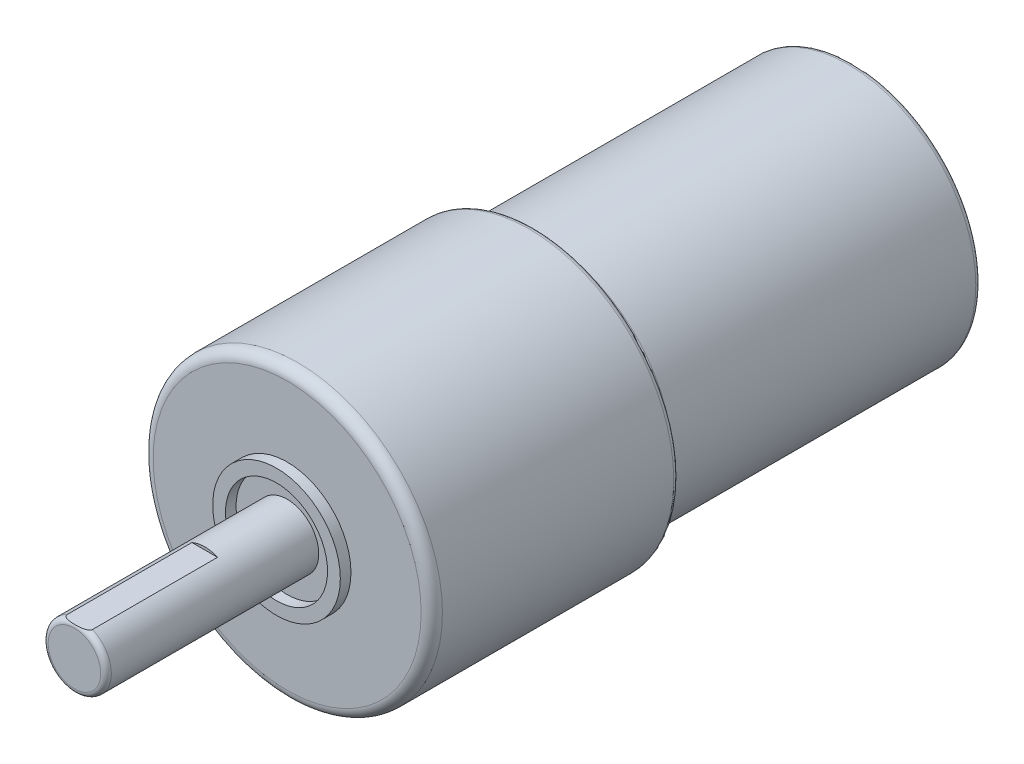
ISO-10303-21;
HEADER;
FILE_DESCRIPTION(('STEP AP214'),'2;1');
FILE_NAME('part.step','',(''),(''),'','','');
FILE_SCHEMA(('AUTOMOTIVE_DESIGN { 1 0 10303 214 1 1 1 1 }'));
ENDSEC;
DATA;
#1=APPLICATION_CONTEXT('core data for automotive mechanical design processes');
#2=APPLICATION_PROTOCOL_DEFINITION('international standard','automotive_design',2000,#1);
#3=PRODUCT_CONTEXT('',#1,'mechanical');
#4=PRODUCT('Part','Part','',(#3));
#5=PRODUCT_RELATED_PRODUCT_CATEGORY('part','',(#4));
#6=PRODUCT_DEFINITION_FORMATION('','',#4);
#7=PRODUCT_DEFINITION_CONTEXT('part definition',#1,'design');
#8=PRODUCT_DEFINITION('design','',#6,#7);
#9=PRODUCT_DEFINITION_SHAPE('','',#8);
#10=(LENGTH_UNIT() NAMED_UNIT(*) SI_UNIT(.MILLI.,.METRE.));
#11=(NAMED_UNIT(*) PLANE_ANGLE_UNIT() SI_UNIT($,.RADIAN.));
#12=(NAMED_UNIT(*) SI_UNIT($,.STERADIAN.) SOLID_ANGLE_UNIT());
#13=UNCERTAINTY_MEASURE_WITH_UNIT(LENGTH_MEASURE(1.E-05),#10,'distance_accuracy_value','');
#14=(GEOMETRIC_REPRESENTATION_CONTEXT(3) GLOBAL_UNCERTAINTY_ASSIGNED_CONTEXT((#13)) GLOBAL_UNIT_ASSIGNED_CONTEXT((#10,
#11,#12)) REPRESENTATION_CONTEXT('',''));
#15=CARTESIAN_POINT('',(0.,0.,0.));
#16=DIRECTION('',(0.,0.,1.));
#17=DIRECTION('',(1.,0.,0.));
#18=AXIS2_PLACEMENT_3D('',#15,#16,#17);
#19=CARTESIAN_POINT('',(0.,0.,-53.25));
#20=DIRECTION('',(0.,0.,1.));
#21=DIRECTION('',(1.,0.,0.));
#22=AXIS2_PLACEMENT_3D('',#19,#20,#21);
#23=CYLINDRICAL_SURFACE('',#22,12.);
#24=CARTESIAN_POINT('',(0.,0.,-52.75));
#25=DIRECTION('',(0.,0.,-1.));
#26=DIRECTION('',(-1.,0.,0.));
#27=AXIS2_PLACEMENT_3D('',#24,#25,#26);
#28=CIRCLE('',#27,12.);
#29=CARTESIAN_POINT('',(-12.,0.,-52.75));
#30=VERTEX_POINT('',#29);
#31=EDGE_CURVE('E11',#30,#30,#28,.F.);
#32=ORIENTED_EDGE('',*,*,#31,.T.);
#33=EDGE_LOOP('',(#32));
#34=FACE_BOUND('',#33,.T.);
#35=CARTESIAN_POINT('',(0.,0.,-24.25));
#36=DIRECTION('',(0.,0.,-1.));
#37=DIRECTION('',(-1.,0.,0.));
#38=AXIS2_PLACEMENT_3D('',#35,#36,#37);
#39=CIRCLE('',#38,12.);
#40=CARTESIAN_POINT('',(-12.,0.,-24.25));
#41=VERTEX_POINT('',#40);
#42=EDGE_CURVE('E68',#41,#41,#39,.T.);
#43=ORIENTED_EDGE('',*,*,#42,.T.);
#44=EDGE_LOOP('',(#43));
#45=FACE_BOUND('',#44,.T.);
#46=ADVANCED_FACE('F53',(#34,#45),#23,.T.);
#47=CARTESIAN_POINT('',(0.,0.,-53.25));
#48=DIRECTION('',(0.,0.,-1.));
#49=DIRECTION('',(-1.,0.,0.));
#50=AXIS2_PLACEMENT_3D('',#47,#48,#49);
#51=PLANE('',#50);
#52=CARTESIAN_POINT('',(0.,0.,-53.25));
#53=DIRECTION('',(0.,0.,-1.));
#54=DIRECTION('',(-1.,0.,0.));
#55=AXIS2_PLACEMENT_3D('',#52,#53,#54);
#56=CIRCLE('',#55,11.5);
#57=CARTESIAN_POINT('',(-11.5,0.,-53.25));
#58=VERTEX_POINT('',#57);
#59=EDGE_CURVE('E60',#58,#58,#56,.T.);
#60=ORIENTED_EDGE('',*,*,#59,.T.);
#61=EDGE_LOOP('',(#60));
#62=FACE_BOUND('',#61,.T.);
#63=ADVANCED_FACE('F84',(#62),#51,.T.);
#64=CARTESIAN_POINT('',(0.,0.,-23.25));
#65=DIRECTION('',(0.,0.,-1.));
#66=DIRECTION('',(-1.,0.,0.));
#67=AXIS2_PLACEMENT_3D('',#64,#65,#66);
#68=PLANE('',#67);
#69=CARTESIAN_POINT('',(0.,0.,-23.25));
#70=DIRECTION('',(0.,0.,-1.));
#71=DIRECTION('',(-1.,0.,0.));
#72=AXIS2_PLACEMENT_3D('',#69,#70,#71);
#73=CIRCLE('',#72,11.);
#74=CARTESIAN_POINT('',(-11.,0.,-23.25));
#75=VERTEX_POINT('',#74);
#76=EDGE_CURVE('E64',#75,#75,#73,.F.);
#77=ORIENTED_EDGE('',*,*,#76,.T.);
#78=EDGE_LOOP('',(#77));
#79=FACE_BOUND('',#78,.T.);
#80=ADVANCED_FACE('F77',(#79),#68,.F.);
#81=CARTESIAN_POINT('',(0.,0.,-24.25));
#82=DIRECTION('',(0.,0.,-1.));
#83=DIRECTION('',(-1.,0.,0.));
#84=AXIS2_PLACEMENT_3D('',#81,#82,#83);
#85=TOROIDAL_SURFACE('',#84,11.,1.);
#86=ORIENTED_EDGE('',*,*,#76,.F.);
#87=EDGE_LOOP('',(#86));
#88=FACE_BOUND('',#87,.T.);
#89=ORIENTED_EDGE('',*,*,#42,.F.);
#90=EDGE_LOOP('',(#89));
#91=FACE_BOUND('',#90,.T.);
#92=ADVANCED_FACE('F75',(#88,#91),#85,.T.);
#93=CARTESIAN_POINT('',(0.,0.,-52.75));
#94=DIRECTION('',(0.,0.,-1.));
#95=DIRECTION('',(-1.,0.,0.));
#96=AXIS2_PLACEMENT_3D('',#93,#94,#95);
#97=TOROIDAL_SURFACE('',#96,11.5,0.5);
#98=ORIENTED_EDGE('',*,*,#31,.F.);
#99=EDGE_LOOP('',(#98));
#100=FACE_BOUND('',#99,.T.);
#101=ORIENTED_EDGE('',*,*,#59,.F.);
#102=EDGE_LOOP('',(#101));
#103=FACE_BOUND('',#102,.T.);
#104=ADVANCED_FACE('F55',(#100,#103),#97,.T.);
#105=CLOSED_SHELL('',(#46,#63,#80,#92,#104));
#106=MANIFOLD_SOLID_BREP('B2',#105);
#107=CARTESIAN_POINT('',(0.,0.,-23.25));
#108=DIRECTION('',(0.,0.,1.));
#109=DIRECTION('',(1.,0.,0.));
#110=AXIS2_PLACEMENT_3D('',#107,#108,#109);
#111=CYLINDRICAL_SURFACE('',#110,13.6000000000003);
#112=CARTESIAN_POINT('',(0.,0.,-22.75));
#113=DIRECTION('',(0.,0.,1.));
#114=DIRECTION('',(1.,0.,0.));
#115=AXIS2_PLACEMENT_3D('',#112,#113,#114);
#116=CIRCLE('',#115,13.6000000000003);
#117=CARTESIAN_POINT('',(13.6000000000003,0.,-22.75));
#118=VERTEX_POINT('',#117);
#119=EDGE_CURVE('E142',#118,#118,#116,.T.);
#120=CARTESIAN_POINT('',(0.,0.,-1.));
#121=DIRECTION('',(0.,0.,1.));
#122=DIRECTION('',(1.,0.,0.));
#123=AXIS2_PLACEMENT_3D('',#120,#121,#122);
#124=CIRCLE('',#123,13.6000000000003);
#125=CARTESIAN_POINT('',(13.6000000000003,0.,-1.));
#126=VERTEX_POINT('',#125);
#127=EDGE_CURVE('E199',#126,#126,#124,.F.);
#128=CARTESIAN_POINT('',(13.6000000000003,0.,-22.75));
#129=CARTESIAN_POINT('',(13.6000000000003,0.,-22.5234375));
#130=CARTESIAN_POINT('',(13.6000000000003,0.,-22.296875));
#131=CARTESIAN_POINT('',(13.6000000000003,0.,-21.84375));
#132=CARTESIAN_POINT('',(13.6000000000003,0.,-21.6171875));
#133=CARTESIAN_POINT('',(13.6000000000003,0.,-21.1640625));
#134=CARTESIAN_POINT('',(13.6000000000003,0.,-20.9375));
#135=CARTESIAN_POINT('',(13.6000000000003,0.,-20.484375));
#136=CARTESIAN_POINT('',(13.6000000000003,0.,-20.2578125));
#137=CARTESIAN_POINT('',(13.6000000000003,0.,-19.8046875));
#138=CARTESIAN_POINT('',(13.6000000000003,0.,-19.578125));
#139=CARTESIAN_POINT('',(13.6000000000003,0.,-19.125));
#140=CARTESIAN_POINT('',(13.6000000000003,0.,-18.8984375));
#141=CARTESIAN_POINT('',(13.6000000000003,0.,-18.4453125));
#142=CARTESIAN_POINT('',(13.6000000000003,0.,-18.21875));
#143=CARTESIAN_POINT('',(13.6000000000003,0.,-17.765625));
#144=CARTESIAN_POINT('',(13.6000000000003,0.,-17.5390625));
#145=CARTESIAN_POINT('',(13.6000000000003,0.,-17.0859375));
#146=CARTESIAN_POINT('',(13.6000000000003,0.,-16.859375));
#147=CARTESIAN_POINT('',(13.6000000000003,0.,-16.40625));
#148=CARTESIAN_POINT('',(13.6000000000003,0.,-16.1796875));
#149=CARTESIAN_POINT('',(13.6000000000003,0.,-15.7265625));
#150=CARTESIAN_POINT('',(13.6000000000003,0.,-15.5));
#151=CARTESIAN_POINT('',(13.6000000000003,0.,-15.046875));
#152=CARTESIAN_POINT('',(13.6000000000003,0.,-14.8203125));
#153=CARTESIAN_POINT('',(13.6000000000003,0.,-14.3671875));
#154=CARTESIAN_POINT('',(13.6000000000003,0.,-14.140625));
#155=CARTESIAN_POINT('',(13.6000000000003,0.,-13.6875));
#156=CARTESIAN_POINT('',(13.6000000000003,0.,-13.4609375));
#157=CARTESIAN_POINT('',(13.6000000000003,0.,-13.0078125));
#158=CARTESIAN_POINT('',(13.6000000000003,0.,-12.78125));
#159=CARTESIAN_POINT('',(13.6000000000003,0.,-12.328125));
#160=CARTESIAN_POINT('',(13.6000000000003,0.,-12.1015625));
#161=CARTESIAN_POINT('',(13.6000000000003,0.,-11.6484375));
#162=CARTESIAN_POINT('',(13.6000000000003,0.,-11.421875));
#163=CARTESIAN_POINT('',(13.6000000000003,0.,-10.96875));
#164=CARTESIAN_POINT('',(13.6000000000003,0.,-10.7421875));
#165=CARTESIAN_POINT('',(13.6000000000003,0.,-10.2890625));
#166=CARTESIAN_POINT('',(13.6000000000003,0.,-10.0625));
#167=CARTESIAN_POINT('',(13.6000000000003,0.,-9.60937500000001));
#168=CARTESIAN_POINT('',(13.6000000000003,0.,-9.3828125));
#169=CARTESIAN_POINT('',(13.6000000000003,0.,-8.9296875));
#170=CARTESIAN_POINT('',(13.6000000000003,0.,-8.703125));
#171=CARTESIAN_POINT('',(13.6000000000003,0.,-8.25));
#172=CARTESIAN_POINT('',(13.6000000000003,0.,-8.0234375));
#173=CARTESIAN_POINT('',(13.6000000000003,0.,-7.57031250000001));
#174=CARTESIAN_POINT('',(13.6000000000003,0.,-7.34375000000001));
#175=CARTESIAN_POINT('',(13.6000000000003,0.,-6.89062500000001));
#176=CARTESIAN_POINT('',(13.6000000000003,0.,-6.6640625));
#177=CARTESIAN_POINT('',(13.6000000000003,0.,-6.2109375));
#178=CARTESIAN_POINT('',(13.6000000000003,0.,-5.984375));
#179=CARTESIAN_POINT('',(13.6000000000003,0.,-5.53125000000001));
#180=CARTESIAN_POINT('',(13.6000000000003,0.,-5.30468750000001));
#181=CARTESIAN_POINT('',(13.6000000000003,0.,-4.85156250000001));
#182=CARTESIAN_POINT('',(13.6000000000003,0.,-4.62500000000001));
#183=CARTESIAN_POINT('',(13.6000000000003,0.,-4.17187500000001));
#184=CARTESIAN_POINT('',(13.6000000000003,0.,-3.94531250000001));
#185=CARTESIAN_POINT('',(13.6000000000003,0.,-3.4921875));
#186=CARTESIAN_POINT('',(13.6000000000003,0.,-3.265625));
#187=CARTESIAN_POINT('',(13.6000000000003,0.,-2.81250000000001));
#188=CARTESIAN_POINT('',(13.6000000000003,0.,-2.58593750000001));
#189=CARTESIAN_POINT('',(13.6000000000003,0.,-2.13281250000001));
#190=CARTESIAN_POINT('',(13.6000000000003,0.,-1.90625000000001));
#191=CARTESIAN_POINT('',(13.6000000000003,0.,-1.45312500000001));
#192=CARTESIAN_POINT('',(13.6000000000003,0.,-1.22656250000001));
#193=CARTESIAN_POINT('',(13.6000000000003,0.,-1.));
#194=B_SPLINE_CURVE_WITH_KNOTS('',3,(#128,#129,#130,#131,#132,#133,#134,#135,#136,#137,#138,
#139,#140,#141,#142,#143,#144,#145,#146,#147,#148,#149,#150,#151,#152,#153,#154,#155,#156,#157,
#158,#159,#160,#161,#162,#163,#164,#165,#166,#167,#168,#169,#170,#171,#172,#173,#174,#175,#176,
#177,#178,#179,#180,#181,#182,#183,#184,#185,#186,#187,#188,#189,#190,#191,#192,#193),
.UNSPECIFIED.,.F.,.F.,(4,2,2,2,2,2,2,2,2,2,2,2,2,2,2,2,2,2,2,2,2,2,2,2,2,2,2,2,2,2,2,2,4),(0.,
0.679687500000001,1.359375,2.0390625,2.71875,3.3984375,4.078125,4.7578125,5.4375,6.1171875,
6.796875,7.4765625,8.15625,8.8359375,9.515625,10.1953125,10.875,11.5546875,12.234375,12.9140625,
13.59375,14.2734375,14.953125,15.6328125,16.3125,16.9921875,17.671875,18.3515625,19.03125,
19.7109375,20.390625,21.0703125,21.75),.UNSPECIFIED.);
#195=EDGE_CURVE('BSEAM134',#118,#126,#194,.T.);
#196=ORIENTED_EDGE('',*,*,#119,.T.);
#197=ORIENTED_EDGE('',*,*,#127,.T.);
#198=ORIENTED_EDGE('',*,*,#195,.T.);
#199=ORIENTED_EDGE('',*,*,#195,.F.);
#200=EDGE_LOOP('',(#196,#198,#197,#199));
#201=FACE_BOUND('',#200,.T.);
#202=ADVANCED_FACE('F134',(#201),#111,.T.);
#203=CARTESIAN_POINT('',(0.,0.,-23.25));
#204=DIRECTION('',(0.,0.,1.));
#205=DIRECTION('',(1.,0.,0.));
#206=AXIS2_PLACEMENT_3D('',#203,#204,#205);
#207=PLANE('',#206);
#208=CARTESIAN_POINT('',(0.,0.,-23.25));
#209=DIRECTION('',(0.,0.,1.));
#210=DIRECTION('',(1.,0.,0.));
#211=AXIS2_PLACEMENT_3D('',#208,#209,#210);
#212=CIRCLE('',#211,13.1000000000003);
#213=CARTESIAN_POINT('',(13.1000000000003,0.,-23.25));
#214=VERTEX_POINT('',#213);
#215=EDGE_CURVE('E51',#214,#214,#212,.F.);
#216=ORIENTED_EDGE('',*,*,#215,.T.);
#217=EDGE_LOOP('',(#216));
#218=FACE_BOUND('',#217,.T.);
#219=ADVANCED_FACE('F239',(#218),#207,.F.);
#220=CARTESIAN_POINT('',(0.,0.,0.));
#221=DIRECTION('',(0.,0.,1.));
#222=DIRECTION('',(1.,0.,0.));
#223=AXIS2_PLACEMENT_3D('',#220,#221,#222);
#224=PLANE('',#223);
#225=CARTESIAN_POINT('',(0.,0.,0.));
#226=DIRECTION('',(0.,0.,1.));
#227=DIRECTION('',(1.,0.,0.));
#228=AXIS2_PLACEMENT_3D('',#225,#226,#227);
#229=CIRCLE('',#228,6.);
#230=CARTESIAN_POINT('',(6.,0.,0.));
#231=VERTEX_POINT('',#230);
#232=EDGE_CURVE('E190',#231,#231,#229,.T.);
#233=ORIENTED_EDGE('',*,*,#232,.F.);
#234=EDGE_LOOP('',(#233));
#235=FACE_BOUND('',#234,.T.);
#236=CARTESIAN_POINT('',(0.,0.,0.));
#237=DIRECTION('',(0.,0.,1.));
#238=DIRECTION('',(1.,0.,0.));
#239=AXIS2_PLACEMENT_3D('',#236,#237,#238);
#240=CIRCLE('',#239,12.6000000000003);
#241=CARTESIAN_POINT('',(12.6000000000003,0.,0.));
#242=VERTEX_POINT('',#241);
#243=EDGE_CURVE('E194',#242,#242,#240,.T.);
#244=ORIENTED_EDGE('',*,*,#243,.T.);
#245=EDGE_LOOP('',(#244));
#246=FACE_BOUND('',#245,.T.);
#247=ADVANCED_FACE('F242',(#235,#246),#224,.T.);
#248=CARTESIAN_POINT('',(0.,0.,-1.));
#249=DIRECTION('',(0.,0.,1.));
#250=DIRECTION('',(1.,0.,0.));
#251=AXIS2_PLACEMENT_3D('',#248,#249,#250);
#252=TOROIDAL_SURFACE('',#251,12.6000000000003,1.);
#253=ORIENTED_EDGE('',*,*,#127,.F.);
#254=EDGE_LOOP('',(#253));
#255=FACE_BOUND('',#254,.T.);
#256=ORIENTED_EDGE('',*,*,#243,.F.);
#257=EDGE_LOOP('',(#256));
#258=FACE_BOUND('',#257,.T.);
#259=ADVANCED_FACE('F234',(#255,#258),#252,.T.);
#260=CARTESIAN_POINT('',(0.,0.,1.));
#261=DIRECTION('',(0.,0.,1.));
#262=DIRECTION('',(1.,0.,0.));
#263=AXIS2_PLACEMENT_3D('',#260,#261,#262);
#264=PLANE('',#263);
#265=CARTESIAN_POINT('',(0.,0.,1.));
#266=DIRECTION('',(0.,0.,1.));
#267=DIRECTION('',(1.,0.,0.));
#268=AXIS2_PLACEMENT_3D('',#265,#266,#267);
#269=CIRCLE('',#268,6.);
#270=CARTESIAN_POINT('',(6.,0.,1.));
#271=VERTEX_POINT('',#270);
#272=EDGE_CURVE('E191',#271,#271,#269,.T.);
#273=ORIENTED_EDGE('',*,*,#272,.T.);
#274=EDGE_LOOP('',(#273));
#275=FACE_BOUND('',#274,.T.);
#276=CARTESIAN_POINT('',(0.,0.,1.));
#277=DIRECTION('',(0.,0.,1.));
#278=DIRECTION('',(1.,0.,0.));
#279=AXIS2_PLACEMENT_3D('',#276,#277,#278);
#280=CIRCLE('',#279,4.8);
#281=CARTESIAN_POINT('',(4.8,0.,1.));
#282=VERTEX_POINT('',#281);
#283=EDGE_CURVE('E187',#282,#282,#280,.T.);
#284=ORIENTED_EDGE('',*,*,#283,.F.);
#285=EDGE_LOOP('',(#284));
#286=FACE_BOUND('',#285,.T.);
#287=ADVANCED_FACE('F231',(#275,#286),#264,.T.);
#288=CARTESIAN_POINT('',(0.,0.,1.));
#289=DIRECTION('',(0.,0.,-1.));
#290=DIRECTION('',(-1.,0.,0.));
#291=AXIS2_PLACEMENT_3D('',#288,#289,#290);
#292=CYLINDRICAL_SURFACE('',#291,6.);
#293=ORIENTED_EDGE('',*,*,#272,.F.);
#294=EDGE_LOOP('',(#293));
#295=FACE_BOUND('',#294,.T.);
#296=ORIENTED_EDGE('',*,*,#232,.T.);
#297=EDGE_LOOP('',(#296));
#298=FACE_BOUND('',#297,.T.);
#299=ADVANCED_FACE('F229',(#295,#298),#292,.T.);
#300=CARTESIAN_POINT('',(0.,0.,1.));
#301=DIRECTION('',(0.,0.,-1.));
#302=DIRECTION('',(-1.,0.,0.));
#303=AXIS2_PLACEMENT_3D('',#300,#301,#302);
#304=CYLINDRICAL_SURFACE('',#303,4.8);
#305=ORIENTED_EDGE('',*,*,#283,.T.);
#306=EDGE_LOOP('',(#305));
#307=FACE_BOUND('',#306,.T.);
#308=CARTESIAN_POINT('',(0.,0.,0.));
#309=DIRECTION('',(0.,0.,1.));
#310=DIRECTION('',(1.,0.,0.));
#311=AXIS2_PLACEMENT_3D('',#308,#309,#310);
#312=CIRCLE('',#311,4.8);
#313=CARTESIAN_POINT('',(4.8,0.,0.));
#314=VERTEX_POINT('',#313);
#315=EDGE_CURVE('E202',#314,#314,#312,.F.);
#316=ORIENTED_EDGE('',*,*,#315,.T.);
#317=EDGE_LOOP('',(#316));
#318=FACE_BOUND('',#317,.T.);
#319=ADVANCED_FACE('F226',(#307,#318),#304,.F.);
#320=CARTESIAN_POINT('',(0.,0.,0.));
#321=DIRECTION('',(0.,0.,1.));
#322=DIRECTION('',(1.,0.,0.));
#323=AXIS2_PLACEMENT_3D('',#320,#321,#322);
#324=CIRCLE('',#323,2.97);
#325=CARTESIAN_POINT('',(2.97,0.,0.));
#326=VERTEX_POINT('',#325);
#327=EDGE_CURVE('E182',#326,#326,#324,.T.);
#328=ORIENTED_EDGE('',*,*,#327,.F.);
#329=EDGE_LOOP('',(#328));
#330=FACE_BOUND('',#329,.T.);
#331=ORIENTED_EDGE('',*,*,#315,.F.);
#332=EDGE_LOOP('',(#331));
#333=FACE_BOUND('',#332,.T.);
#334=ADVANCED_FACE('F225',(#330,#333),#224,.T.);
#335=CARTESIAN_POINT('',(0.,0.,20.));
#336=DIRECTION('',(0.,0.,-1.));
#337=DIRECTION('',(-1.,0.,0.));
#338=AXIS2_PLACEMENT_3D('',#335,#336,#337);
#339=CYLINDRICAL_SURFACE('',#338,2.97);
#340=DIRECTION('',(0.,0.,1.));
#341=VECTOR('',#340,1.);
#342=CARTESIAN_POINT('',(1.20402450141183,2.715,7.75));
#343=LINE('',#342,#341);
#344=CARTESIAN_POINT('',(1.20402450141183,2.715,7.75));
#345=VERTEX_POINT('',#344);
#346=CARTESIAN_POINT('',(1.20402450141183,2.715,19.5000000000003));
#347=VERTEX_POINT('',#346);
#348=EDGE_CURVE('E174',#345,#347,#343,.T.);
#349=ORIENTED_EDGE('',*,*,#348,.T.);
#350=CARTESIAN_POINT('',(0.,0.,19.5));
#351=DIRECTION('',(0.,0.,1.));
#352=DIRECTION('',(1.,0.,0.));
#353=AXIS2_PLACEMENT_3D('',#350,#351,#352);
#354=CIRCLE('',#353,2.97);
#355=CARTESIAN_POINT('',(-1.20402450141183,2.715,19.5));
#356=VERTEX_POINT('',#355);
#357=EDGE_CURVE('E180',#347,#356,#354,.F.);
#358=ORIENTED_EDGE('',*,*,#357,.T.);
#359=DIRECTION('',(0.,0.,1.));
#360=VECTOR('',#359,1.);
#361=CARTESIAN_POINT('',(-1.20402450141183,2.715,7.75));
#362=LINE('',#361,#360);
#363=CARTESIAN_POINT('',(-1.20402450141183,2.715,7.75));
#364=VERTEX_POINT('',#363);
#365=EDGE_CURVE('E173',#364,#356,#362,.T.);
#366=ORIENTED_EDGE('',*,*,#365,.F.);
#367=CARTESIAN_POINT('',(0.,0.,7.75));
#368=DIRECTION('',(0.,0.,1.));
#369=DIRECTION('',(1.,0.,0.));
#370=AXIS2_PLACEMENT_3D('',#367,#368,#369);
#371=CIRCLE('',#370,2.97);
#372=EDGE_CURVE('E165',#345,#364,#371,.T.);
#373=ORIENTED_EDGE('',*,*,#372,.F.);
#374=EDGE_LOOP('',(#349,#358,#366,#373));
#375=FACE_BOUND('',#374,.T.);
#376=ORIENTED_EDGE('',*,*,#327,.T.);
#377=EDGE_LOOP('',(#376));
#378=FACE_BOUND('',#377,.T.);
#379=ADVANCED_FACE('F177',(#375,#378),#339,.T.);
#380=CARTESIAN_POINT('',(0.,0.,20.));
#381=DIRECTION('',(0.,0.,1.));
#382=DIRECTION('',(1.,0.,0.));
#383=AXIS2_PLACEMENT_3D('',#380,#381,#382);
#384=PLANE('',#383);
#385=CARTESIAN_POINT('',(0.,0.,20.));
#386=DIRECTION('',(0.,0.,1.));
#387=DIRECTION('',(1.,0.,0.));
#388=AXIS2_PLACEMENT_3D('',#385,#386,#387);
#389=CIRCLE('',#388,2.47);
#390=CARTESIAN_POINT('',(-1.00132677390142,2.25792929292929,20.));
#391=VERTEX_POINT('',#390);
#392=EDGE_CURVE('E147',#391,#391,#389,.T.);
#393=ORIENTED_EDGE('',*,*,#392,.T.);
#394=EDGE_LOOP('',(#393));
#395=FACE_BOUND('',#394,.T.);
#396=ADVANCED_FACE('F219',(#395),#384,.T.);
#397=CARTESIAN_POINT('',(0.,2.715,7.75));
#398=DIRECTION('',(0.,-1.,0.));
#399=DIRECTION('',(0.,0.,-1.));
#400=AXIS2_PLACEMENT_3D('',#397,#398,#399);
#401=PLANE('',#400);
#402=ORIENTED_EDGE('',*,*,#365,.T.);
#403=CARTESIAN_POINT('',(-1.20402450141183,2.715,19.5));
#404=CARTESIAN_POINT('',(-1.20405576261567,2.715,19.5123798530897));
#405=CARTESIAN_POINT('',(-1.20289223984137,2.715,19.5247245335894));
#406=CARTESIAN_POINT('',(-1.1984519190372,2.715,19.5489138196987));
#407=CARTESIAN_POINT('',(-1.1951950216218,2.715,19.5607620268168));
#408=CARTESIAN_POINT('',(-1.18684859047163,2.715,19.5837352968189));
#409=CARTESIAN_POINT('',(-1.18176498811649,2.715,19.5948625641667));
#410=CARTESIAN_POINT('',(-1.17009999158288,2.715,19.6163222734444));
#411=CARTESIAN_POINT('',(-1.16351486280268,2.715,19.6266526461156));
#412=CARTESIAN_POINT('',(-1.14410528529989,2.715,19.6534456559513));
#413=CARTESIAN_POINT('',(-1.13015679218178,2.715,19.6690923742678));
#414=CARTESIAN_POINT('',(-1.10004873553322,2.715,19.6980753786355));
#415=CARTESIAN_POINT('',(-1.08388315608863,2.715,19.711405146672));
#416=CARTESIAN_POINT('',(-1.03643251888768,2.715,19.7461038723726));
#417=CARTESIAN_POINT('',(-1.00351966921305,2.715,19.7652233088807));
#418=CARTESIAN_POINT('',(-0.935417918829869,2.715,19.7987487365947));
#419=CARTESIAN_POINT('',(-0.900222813968831,2.715,19.8131411744118));
#420=CARTESIAN_POINT('',(-0.811050645939381,2.715,19.8446481675488));
#421=CARTESIAN_POINT('',(-0.756333233982431,2.715,19.8596319105109));
#422=CARTESIAN_POINT('',(-0.645707828975577,2.715,19.8844528949822));
#423=CARTESIAN_POINT('',(-0.589797286089737,2.715,19.8942776557432));
#424=CARTESIAN_POINT('',(-0.477289157264023,2.715,19.9102929407071));
#425=CARTESIAN_POINT('',(-0.420689930050787,2.715,19.9164715619895));
#426=CARTESIAN_POINT('',(-0.307250657787107,2.715,19.9261052267674));
#427=CARTESIAN_POINT('',(-0.250410522148138,2.715,19.9295591333232));
#428=CARTESIAN_POINT('',(-0.143262921834801,2.715,19.9340001028677));
#429=CARTESIAN_POINT('',(-0.0929648694462487,2.715,19.9352274327454));
#430=CARTESIAN_POINT('',(0.00764515150683547,2.715,19.9361179058891));
#431=CARTESIAN_POINT('',(0.0579571201378578,2.715,19.9357810415479));
#432=CARTESIAN_POINT('',(0.158510605567068,2.715,19.9335029242773));
#433=CARTESIAN_POINT('',(0.20875214702858,2.715,19.9315627926167));
#434=CARTESIAN_POINT('',(0.309122010216826,2.715,19.9258437843293));
#435=CARTESIAN_POINT('',(0.359250359156332,2.715,19.9220654108592));
#436=CARTESIAN_POINT('',(0.451860029503186,2.715,19.9129416162134));
#437=CARTESIAN_POINT('',(0.494371796842228,2.715,19.907912109876));
#438=CARTESIAN_POINT('',(0.579089902773275,2.715,19.8957470419872));
#439=CARTESIAN_POINT('',(0.621296332096267,2.715,19.8886121348051));
#440=CARTESIAN_POINT('',(0.705100701096402,2.715,19.871618092958));
#441=CARTESIAN_POINT('',(0.746699500947429,2.715,19.861763304247));
#442=CARTESIAN_POINT('',(0.828844140643185,2.715,19.8384255174473));
#443=CARTESIAN_POINT('',(0.869391643374022,2.715,19.8249486879849));
#444=CARTESIAN_POINT('',(0.940794389802405,2.715,19.7961067196889));
#445=CARTESIAN_POINT('',(0.971999183611097,2.715,19.7816206471493));
#446=CARTESIAN_POINT('',(1.03202068959082,2.715,19.7483684352071));
#447=CARTESIAN_POINT('',(1.06084736650771,2.715,19.7296215364775));
#448=CARTESIAN_POINT('',(1.10020699274253,2.715,19.697628352926));
#449=CARTESIAN_POINT('',(1.1124921721772,2.715,19.6865497819624));
#450=CARTESIAN_POINT('',(1.13555979857851,2.715,19.662891682657));
#451=CARTESIAN_POINT('',(1.14634228732096,2.715,19.6503121960597));
#452=CARTESIAN_POINT('',(1.16436217327222,2.715,19.6255206158486));
#453=CARTESIAN_POINT('',(1.17188695096576,2.715,19.6135200805331));
#454=CARTESIAN_POINT('',(1.18485946690529,2.715,19.5884681654864));
#455=CARTESIAN_POINT('',(1.19031425588546,2.715,19.5754205397393));
#456=CARTESIAN_POINT('',(1.19792587636719,2.715,19.5508631523374));
#457=CARTESIAN_POINT('',(1.20049168291995,2.715,19.5394814331418));
#458=CARTESIAN_POINT('',(1.20370701909054,2.715,19.5163516415663));
#459=CARTESIAN_POINT('',(1.20433942189961,2.715,19.5046012211998));
#460=CARTESIAN_POINT('',(1.20389881227297,2.715,19.4928621440846));
#461=B_SPLINE_CURVE_WITH_KNOTS('',3,(#403,#404,#405,#406,#407,#408,#409,#410,#411,#412,#413,
#414,#415,#416,#417,#418,#419,#420,#421,#422,#423,#424,#425,#426,#427,#428,#429,#430,#431,#432,
#433,#434,#435,#436,#437,#438,#439,#440,#441,#442,#443,#444,#445,#446,#447,#448,#449,#450,#451,
#452,#453,#454,#455,#456,#457,#458,#459,#460),.UNSPECIFIED.,.F.,.F.,(4,2,2,2,2,2,2,2,2,2,2,2,2,
2,2,2,2,2,2,2,2,2,2,2,2,2,2,2,4),(0.,0.0370291173665893,0.0737113226906708,0.110275480144718,
0.14693159174168,0.209450727824004,0.27214299135719,0.385688075351259,0.499555933361927,
0.669309241802342,0.839471351661151,1.01018593057883,1.1809717058258,1.33188591052146,
1.48280084917253,1.63361033245158,1.78437855991769,1.91276406263372,2.04110970444328,
2.16925144514226,2.29717631811134,2.40018469015582,2.50273683583744,2.55226441524915,
2.60179061748613,2.64413029047167,2.68632442444966,2.72116834267059,2.75632003980593),.UNSPECIFIED.);
#462=EDGE_CURVE('E154',#356,#347,#461,.T.);
#463=ORIENTED_EDGE('',*,*,#462,.T.);
#464=ORIENTED_EDGE('',*,*,#348,.F.);
#465=DIRECTION('',(1.,0.,0.));
#466=VECTOR('',#465,1.);
#467=CARTESIAN_POINT('',(0.,2.715,7.75));
#468=LINE('',#467,#466);
#469=EDGE_CURVE('E168',#364,#345,#468,.T.);
#470=ORIENTED_EDGE('',*,*,#469,.F.);
#471=EDGE_LOOP('',(#402,#463,#464,#470));
#472=FACE_BOUND('',#471,.T.);
#473=ADVANCED_FACE('F172',(#472),#401,.F.);
#474=CARTESIAN_POINT('',(0.,0.,7.75));
#475=DIRECTION('',(0.,0.,1.));
#476=DIRECTION('',(1.,0.,0.));
#477=AXIS2_PLACEMENT_3D('',#474,#475,#476);
#478=PLANE('',#477);
#479=ORIENTED_EDGE('',*,*,#372,.T.);
#480=ORIENTED_EDGE('',*,*,#469,.T.);
#481=EDGE_LOOP('',(#479,#480));
#482=FACE_BOUND('',#481,.T.);
#483=ADVANCED_FACE('F167',(#482),#478,.T.);
#484=CARTESIAN_POINT('',(0.,0.,19.5));
#485=DIRECTION('',(0.,0.,1.));
#486=DIRECTION('',(1.,0.,0.));
#487=AXIS2_PLACEMENT_3D('',#484,#485,#486);
#488=TOROIDAL_SURFACE('',#487,2.47,0.5);
#489=ORIENTED_EDGE('',*,*,#462,.F.);
#490=ORIENTED_EDGE('',*,*,#357,.F.);
#491=EDGE_LOOP('',(#489,#490));
#492=FACE_BOUND('',#491,.T.);
#493=ORIENTED_EDGE('',*,*,#392,.F.);
#494=EDGE_LOOP('',(#493));
#495=FACE_BOUND('',#494,.T.);
#496=ADVANCED_FACE('F212',(#492,#495),#488,.T.);
#497=CARTESIAN_POINT('',(0.,0.,-22.75));
#498=DIRECTION('',(0.,0.,1.));
#499=DIRECTION('',(1.,0.,0.));
#500=AXIS2_PLACEMENT_3D('',#497,#498,#499);
#501=TOROIDAL_SURFACE('',#500,13.1000000000003,0.5);
#502=ORIENTED_EDGE('',*,*,#215,.F.);
#503=EDGE_LOOP('',(#502));
#504=FACE_BOUND('',#503,.T.);
#505=ORIENTED_EDGE('',*,*,#119,.F.);
#506=EDGE_LOOP('',(#505));
#507=FACE_BOUND('',#506,.T.);
#508=ADVANCED_FACE('F136',(#504,#507),#501,.T.);
#509=CLOSED_SHELL('',(#202,#219,#247,#259,#287,#299,#319,#334,#379,#396,#473,#483,#496,#508));
#510=MANIFOLD_SOLID_BREP('B6',#509);
#511=ADVANCED_BREP_SHAPE_REPRESENTATION('',(#18,#106,#510),#14);
#512=SHAPE_DEFINITION_REPRESENTATION(#9,#511);
ENDSEC;
END-ISO-10303-21;
